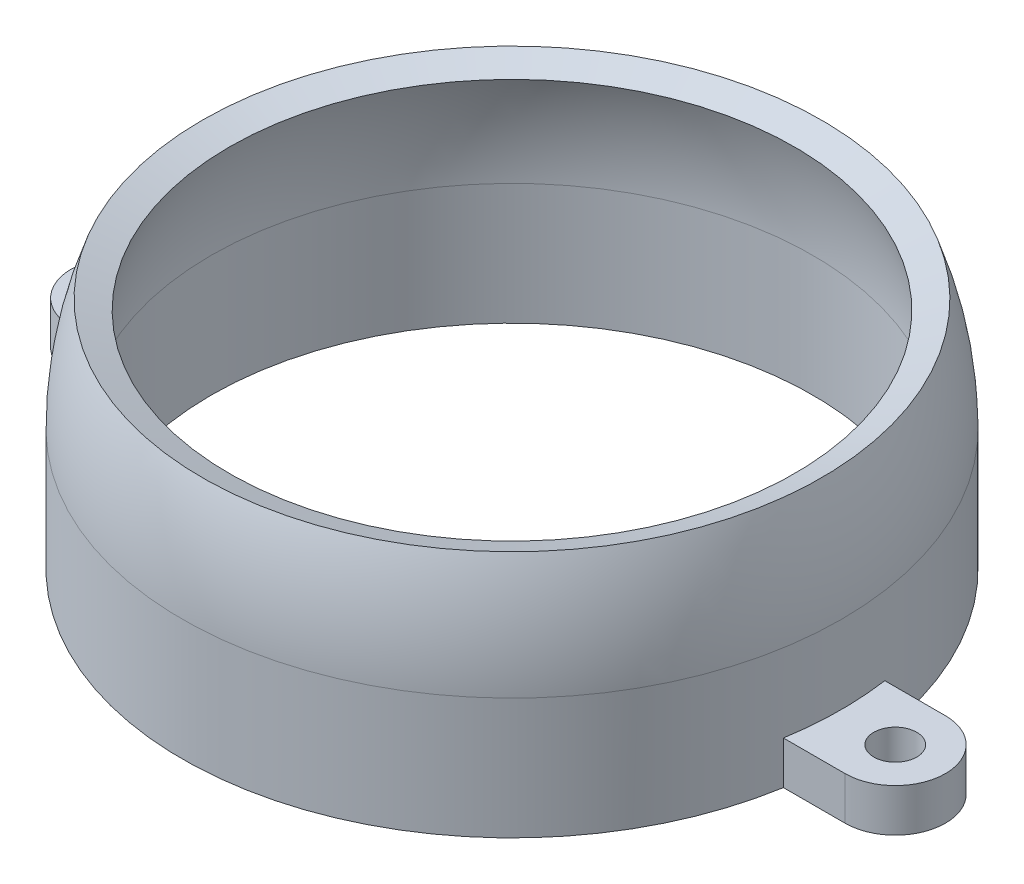
ISO-10303-21;
HEADER;
FILE_DESCRIPTION(('STEP AP214'),'2;1');
FILE_NAME('part.step','',(''),(''),'','','');
FILE_SCHEMA(('AUTOMOTIVE_DESIGN { 1 0 10303 214 1 1 1 1 }'));
ENDSEC;
DATA;
#1=APPLICATION_CONTEXT('core data for automotive mechanical design processes');
#2=APPLICATION_PROTOCOL_DEFINITION('international standard','automotive_design',2000,#1);
#3=PRODUCT_CONTEXT('',#1,'mechanical');
#4=PRODUCT('Part','Part','',(#3));
#5=PRODUCT_RELATED_PRODUCT_CATEGORY('part','',(#4));
#6=PRODUCT_DEFINITION_FORMATION('','',#4);
#7=PRODUCT_DEFINITION_CONTEXT('part definition',#1,'design');
#8=PRODUCT_DEFINITION('design','',#6,#7);
#9=PRODUCT_DEFINITION_SHAPE('','',#8);
#10=(LENGTH_UNIT() NAMED_UNIT(*) SI_UNIT(.MILLI.,.METRE.));
#11=(NAMED_UNIT(*) PLANE_ANGLE_UNIT() SI_UNIT($,.RADIAN.));
#12=(NAMED_UNIT(*) SI_UNIT($,.STERADIAN.) SOLID_ANGLE_UNIT());
#13=UNCERTAINTY_MEASURE_WITH_UNIT(LENGTH_MEASURE(1.E-05),#10,'distance_accuracy_value','');
#14=(GEOMETRIC_REPRESENTATION_CONTEXT(3) GLOBAL_UNCERTAINTY_ASSIGNED_CONTEXT((#13)) GLOBAL_UNIT_ASSIGNED_CONTEXT((#10,
#11,#12)) REPRESENTATION_CONTEXT('',''));
#15=CARTESIAN_POINT('',(0.,0.,0.));
#16=DIRECTION('',(0.,0.,1.));
#17=DIRECTION('',(1.,0.,0.));
#18=AXIS2_PLACEMENT_3D('',#15,#16,#17);
#19=CARTESIAN_POINT('',(0.,17.,0.));
#20=DIRECTION('',(0.,-1.,0.));
#21=DIRECTION('',(1.,0.,0.));
#22=AXIS2_PLACEMENT_3D('',#19,#20,#21);
#23=PLANE('',#22);
#24=CARTESIAN_POINT('',(-27.,17.,0.250000000000004));
#25=DIRECTION('',(0.,-1.,0.));
#26=DIRECTION('',(1.,0.,0.));
#27=AXIS2_PLACEMENT_3D('',#24,#25,#26);
#28=CIRCLE('',#27,1.5);
#29=CARTESIAN_POINT('',(-25.5,17.,0.250000000000004));
#30=VERTEX_POINT('',#29);
#31=EDGE_CURVE('E177',#30,#30,#28,.F.);
#32=ORIENTED_EDGE('',*,*,#31,.T.);
#33=EDGE_LOOP('',(#32));
#34=FACE_BOUND('',#33,.T.);
#35=DIRECTION('',(-1.,0.,0.));
#36=VECTOR('',#35,1.);
#37=CARTESIAN_POINT('',(-27.,17.,-3.25));
#38=LINE('',#37,#36);
#39=CARTESIAN_POINT('',(-22.7692226481274,17.,-3.24999999999999));
#40=VERTEX_POINT('',#39);
#41=CARTESIAN_POINT('',(-27.,17.,-3.25));
#42=VERTEX_POINT('',#41);
#43=EDGE_CURVE('E117',#40,#42,#38,.T.);
#44=ORIENTED_EDGE('',*,*,#43,.F.);
#45=CARTESIAN_POINT('',(0.,17.,0.));
#46=DIRECTION('',(0.,-1.,0.));
#47=DIRECTION('',(1.,0.,0.));
#48=AXIS2_PLACEMENT_3D('',#45,#46,#47);
#49=CIRCLE('',#48,23.);
#50=CARTESIAN_POINT('',(22.7692226481274,17.,-3.25));
#51=VERTEX_POINT('',#50);
#52=EDGE_CURVE('E175',#40,#51,#49,.T.);
#53=ORIENTED_EDGE('',*,*,#52,.T.);
#54=DIRECTION('',(-1.,0.,0.));
#55=VECTOR('',#54,1.);
#56=CARTESIAN_POINT('',(27.,17.,-3.25));
#57=LINE('',#56,#55);
#58=CARTESIAN_POINT('',(27.,17.,-3.25));
#59=VERTEX_POINT('',#58);
#60=EDGE_CURVE('E168',#59,#51,#57,.T.);
#61=ORIENTED_EDGE('',*,*,#60,.F.);
#62=CARTESIAN_POINT('',(27.,17.,0.250000000000004));
#63=DIRECTION('',(0.,-1.,0.));
#64=DIRECTION('',(1.,0.,0.));
#65=AXIS2_PLACEMENT_3D('',#62,#63,#64);
#66=CIRCLE('',#65,3.5);
#67=CARTESIAN_POINT('',(27.,17.,3.75));
#68=VERTEX_POINT('',#67);
#69=EDGE_CURVE('E170',#68,#59,#66,.F.);
#70=ORIENTED_EDGE('',*,*,#69,.F.);
#71=DIRECTION('',(1.,0.,0.));
#72=VECTOR('',#71,1.);
#73=CARTESIAN_POINT('',(27.,17.,3.75));
#74=LINE('',#73,#72);
#75=CARTESIAN_POINT('',(22.6922343545099,17.,3.75));
#76=VERTEX_POINT('',#75);
#77=EDGE_CURVE('E165',#76,#68,#74,.T.);
#78=ORIENTED_EDGE('',*,*,#77,.F.);
#79=CARTESIAN_POINT('',(-22.6922343545099,17.,3.75));
#80=VERTEX_POINT('',#79);
#81=EDGE_CURVE('E112',#76,#80,#49,.T.);
#82=ORIENTED_EDGE('',*,*,#81,.T.);
#83=DIRECTION('',(1.,0.,0.));
#84=VECTOR('',#83,1.);
#85=CARTESIAN_POINT('',(-27.,17.,3.75));
#86=LINE('',#85,#84);
#87=CARTESIAN_POINT('',(-27.,17.,3.75));
#88=VERTEX_POINT('',#87);
#89=EDGE_CURVE('E106',#88,#80,#86,.T.);
#90=ORIENTED_EDGE('',*,*,#89,.F.);
#91=CARTESIAN_POINT('',(-27.,17.,0.250000000000004));
#92=DIRECTION('',(0.,-1.,0.));
#93=DIRECTION('',(1.,0.,0.));
#94=AXIS2_PLACEMENT_3D('',#91,#92,#93);
#95=CIRCLE('',#94,3.5);
#96=EDGE_CURVE('E109',#42,#88,#95,.F.);
#97=ORIENTED_EDGE('',*,*,#96,.F.);
#98=EDGE_LOOP('',(#44,#53,#61,#70,#78,#82,#90,#97));
#99=FACE_BOUND('',#98,.T.);
#100=CARTESIAN_POINT('',(27.,17.,0.250000000000004));
#101=DIRECTION('',(0.,-1.,0.));
#102=DIRECTION('',(1.,0.,0.));
#103=AXIS2_PLACEMENT_3D('',#100,#101,#102);
#104=CIRCLE('',#103,1.5);
#105=CARTESIAN_POINT('',(28.5,17.,0.250000000000004));
#106=VERTEX_POINT('',#105);
#107=EDGE_CURVE('E139',#106,#106,#104,.F.);
#108=ORIENTED_EDGE('',*,*,#107,.T.);
#109=EDGE_LOOP('',(#108));
#110=FACE_BOUND('',#109,.T.);
#111=CARTESIAN_POINT('',(0.,17.,0.));
#112=DIRECTION('',(0.,-1.,0.));
#113=DIRECTION('',(1.,0.,0.));
#114=AXIS2_PLACEMENT_3D('',#111,#112,#113);
#115=CIRCLE('',#114,21.);
#116=CARTESIAN_POINT('',(21.,17.,0.));
#117=VERTEX_POINT('',#116);
#118=EDGE_CURVE('E125',#117,#117,#115,.T.);
#119=ORIENTED_EDGE('',*,*,#118,.F.);
#120=EDGE_LOOP('',(#119));
#121=FACE_BOUND('',#120,.T.);
#122=ADVANCED_FACE('F37',(#34,#99,#110,#121),#23,.T.);
#123=CARTESIAN_POINT('',(0.,25.4499443206436,0.));
#124=DIRECTION('',(0.,1.,0.));
#125=DIRECTION('',(-1.,0.,0.));
#126=AXIS2_PLACEMENT_3D('',#123,#124,#125);
#127=CYLINDRICAL_SURFACE('',#126,23.);
#128=CARTESIAN_POINT('',(0.,25.4499443206436,0.));
#129=DIRECTION('',(0.,1.,0.));
#130=DIRECTION('',(-1.,0.,0.));
#131=AXIS2_PLACEMENT_3D('',#128,#129,#130);
#132=CIRCLE('',#131,23.);
#133=CARTESIAN_POINT('',(-23.,25.4499443206436,0.));
#134=VERTEX_POINT('',#133);
#135=EDGE_CURVE('E167',#134,#134,#132,.T.);
#136=ORIENTED_EDGE('',*,*,#135,.F.);
#137=EDGE_LOOP('',(#136));
#138=FACE_BOUND('',#137,.T.);
#139=ORIENTED_EDGE('',*,*,#81,.F.);
#140=DIRECTION('',(0.,-1.,0.));
#141=VECTOR('',#140,1.);
#142=CARTESIAN_POINT('',(22.6922343545099,20.,3.75));
#143=LINE('',#142,#141);
#144=CARTESIAN_POINT('',(22.6922343545099,20.,3.75));
#145=VERTEX_POINT('',#144);
#146=EDGE_CURVE('E149',#145,#76,#143,.T.);
#147=ORIENTED_EDGE('',*,*,#146,.F.);
#148=CARTESIAN_POINT('',(0.,20.,0.));
#149=DIRECTION('',(0.,1.,0.));
#150=DIRECTION('',(0.,0.,-1.));
#151=AXIS2_PLACEMENT_3D('',#148,#149,#150);
#152=CIRCLE('',#151,23.);
#153=CARTESIAN_POINT('',(22.7692226481274,20.,-3.25));
#154=VERTEX_POINT('',#153);
#155=EDGE_CURVE('E153',#145,#154,#152,.T.);
#156=ORIENTED_EDGE('',*,*,#155,.T.);
#157=DIRECTION('',(0.,-1.,0.));
#158=VECTOR('',#157,1.);
#159=CARTESIAN_POINT('',(22.7692226481274,20.,-3.25));
#160=LINE('',#159,#158);
#161=EDGE_CURVE('E146',#154,#51,#160,.T.);
#162=ORIENTED_EDGE('',*,*,#161,.T.);
#163=ORIENTED_EDGE('',*,*,#52,.F.);
#164=DIRECTION('',(0.,-1.,0.));
#165=VECTOR('',#164,1.);
#166=CARTESIAN_POINT('',(-22.7692226481274,20.,-3.24999999999999));
#167=LINE('',#166,#165);
#168=CARTESIAN_POINT('',(-22.7692226481274,20.,-3.24999999999999));
#169=VERTEX_POINT('',#168);
#170=EDGE_CURVE('E133',#169,#40,#167,.T.);
#171=ORIENTED_EDGE('',*,*,#170,.F.);
#172=CARTESIAN_POINT('',(0.,20.,0.));
#173=DIRECTION('',(0.,1.,0.));
#174=DIRECTION('',(0.,0.,1.));
#175=AXIS2_PLACEMENT_3D('',#172,#173,#174);
#176=CIRCLE('',#175,23.);
#177=CARTESIAN_POINT('',(-22.6922343545099,20.,3.75));
#178=VERTEX_POINT('',#177);
#179=EDGE_CURVE('E240',#169,#178,#176,.T.);
#180=ORIENTED_EDGE('',*,*,#179,.T.);
#181=DIRECTION('',(0.,-1.,0.));
#182=VECTOR('',#181,1.);
#183=CARTESIAN_POINT('',(-22.6922343545099,20.,3.75));
#184=LINE('',#183,#182);
#185=EDGE_CURVE('E130',#178,#80,#184,.T.);
#186=ORIENTED_EDGE('',*,*,#185,.T.);
#187=EDGE_LOOP('',(#139,#147,#156,#162,#163,#171,#180,#186));
#188=FACE_BOUND('',#187,.T.);
#189=ADVANCED_FACE('F202',(#138,#188),#127,.T.);
#190=CARTESIAN_POINT('',(0.,25.4499443206436,0.));
#191=DIRECTION('',(0.,1.,0.));
#192=DIRECTION('',(-1.,0.,0.));
#193=AXIS2_PLACEMENT_3D('',#190,#191,#192);
#194=CYLINDRICAL_SURFACE('',#193,21.);
#195=CARTESIAN_POINT('',(0.,25.4499443206436,0.));
#196=DIRECTION('',(0.,1.,0.));
#197=DIRECTION('',(-1.,0.,0.));
#198=AXIS2_PLACEMENT_3D('',#195,#196,#197);
#199=CIRCLE('',#198,21.);
#200=CARTESIAN_POINT('',(-21.,25.4499443206436,0.));
#201=VERTEX_POINT('',#200);
#202=EDGE_CURVE('E247',#201,#201,#199,.T.);
#203=ORIENTED_EDGE('',*,*,#202,.T.);
#204=EDGE_LOOP('',(#203));
#205=FACE_BOUND('',#204,.T.);
#206=ORIENTED_EDGE('',*,*,#118,.T.);
#207=EDGE_LOOP('',(#206));
#208=FACE_BOUND('',#207,.T.);
#209=ADVANCED_FACE('F204',(#205,#208),#194,.F.);
#210=CARTESIAN_POINT('',(-27.,20.,0.250000000000004));
#211=DIRECTION('',(0.,-1.,0.));
#212=DIRECTION('',(0.,0.,-1.));
#213=AXIS2_PLACEMENT_3D('',#210,#211,#212);
#214=CYLINDRICAL_SURFACE('',#213,3.5);
#215=DIRECTION('',(0.,-1.,0.));
#216=VECTOR('',#215,1.);
#217=CARTESIAN_POINT('',(-27.,20.,-3.25));
#218=LINE('',#217,#216);
#219=CARTESIAN_POINT('',(-27.,20.,-3.25));
#220=VERTEX_POINT('',#219);
#221=EDGE_CURVE('E124',#220,#42,#218,.T.);
#222=ORIENTED_EDGE('',*,*,#221,.T.);
#223=ORIENTED_EDGE('',*,*,#96,.T.);
#224=DIRECTION('',(0.,-1.,0.));
#225=VECTOR('',#224,1.);
#226=CARTESIAN_POINT('',(-27.,20.,3.75));
#227=LINE('',#226,#225);
#228=CARTESIAN_POINT('',(-27.,20.,3.75));
#229=VERTEX_POINT('',#228);
#230=EDGE_CURVE('E122',#229,#88,#227,.T.);
#231=ORIENTED_EDGE('',*,*,#230,.F.);
#232=CARTESIAN_POINT('',(-27.,20.,0.250000000000004));
#233=DIRECTION('',(0.,-1.,0.));
#234=DIRECTION('',(0.,0.,-1.));
#235=AXIS2_PLACEMENT_3D('',#232,#233,#234);
#236=CIRCLE('',#235,3.5);
#237=EDGE_CURVE('E237',#229,#220,#236,.T.);
#238=ORIENTED_EDGE('',*,*,#237,.T.);
#239=EDGE_LOOP('',(#222,#223,#231,#238));
#240=FACE_BOUND('',#239,.T.);
#241=ADVANCED_FACE('F120',(#240),#214,.T.);
#242=CARTESIAN_POINT('',(-27.,20.,3.75));
#243=DIRECTION('',(0.,0.,1.));
#244=DIRECTION('',(1.,0.,0.));
#245=AXIS2_PLACEMENT_3D('',#242,#243,#244);
#246=PLANE('',#245);
#247=ORIENTED_EDGE('',*,*,#230,.T.);
#248=ORIENTED_EDGE('',*,*,#89,.T.);
#249=ORIENTED_EDGE('',*,*,#185,.F.);
#250=DIRECTION('',(-1.,0.,0.));
#251=VECTOR('',#250,1.);
#252=CARTESIAN_POINT('',(-27.,20.,3.75));
#253=LINE('',#252,#251);
#254=EDGE_CURVE('E129',#178,#229,#253,.T.);
#255=ORIENTED_EDGE('',*,*,#254,.T.);
#256=EDGE_LOOP('',(#247,#248,#249,#255));
#257=FACE_BOUND('',#256,.T.);
#258=ADVANCED_FACE('F39',(#257),#246,.T.);
#259=CARTESIAN_POINT('',(-27.,20.,-3.25));
#260=DIRECTION('',(0.,0.,-1.));
#261=DIRECTION('',(-1.,0.,0.));
#262=AXIS2_PLACEMENT_3D('',#259,#260,#261);
#263=PLANE('',#262);
#264=ORIENTED_EDGE('',*,*,#170,.T.);
#265=ORIENTED_EDGE('',*,*,#43,.T.);
#266=ORIENTED_EDGE('',*,*,#221,.F.);
#267=DIRECTION('',(1.,0.,0.));
#268=VECTOR('',#267,1.);
#269=CARTESIAN_POINT('',(-27.,20.,-3.25));
#270=LINE('',#269,#268);
#271=EDGE_CURVE('E238',#220,#169,#270,.T.);
#272=ORIENTED_EDGE('',*,*,#271,.T.);
#273=EDGE_LOOP('',(#264,#265,#266,#272));
#274=FACE_BOUND('',#273,.T.);
#275=ADVANCED_FACE('F226',(#274),#263,.T.);
#276=CARTESIAN_POINT('',(-27.,20.,0.250000000000004));
#277=DIRECTION('',(0.,-1.,0.));
#278=DIRECTION('',(0.,0.,-1.));
#279=AXIS2_PLACEMENT_3D('',#276,#277,#278);
#280=CYLINDRICAL_SURFACE('',#279,1.5);
#281=CARTESIAN_POINT('',(-27.,20.,0.250000000000004));
#282=DIRECTION('',(0.,-1.,0.));
#283=DIRECTION('',(0.,0.,-1.));
#284=AXIS2_PLACEMENT_3D('',#281,#282,#283);
#285=CIRCLE('',#284,1.5);
#286=CARTESIAN_POINT('',(-27.,20.,-1.25));
#287=VERTEX_POINT('',#286);
#288=EDGE_CURVE('E147',#287,#287,#285,.T.);
#289=ORIENTED_EDGE('',*,*,#288,.F.);
#290=EDGE_LOOP('',(#289));
#291=FACE_BOUND('',#290,.T.);
#292=ORIENTED_EDGE('',*,*,#31,.F.);
#293=EDGE_LOOP('',(#292));
#294=FACE_BOUND('',#293,.T.);
#295=ADVANCED_FACE('F220',(#291,#294),#280,.F.);
#296=CARTESIAN_POINT('',(27.,20.,0.250000000000004));
#297=DIRECTION('',(0.,-1.,0.));
#298=DIRECTION('',(0.,0.,-1.));
#299=AXIS2_PLACEMENT_3D('',#296,#297,#298);
#300=CYLINDRICAL_SURFACE('',#299,3.5);
#301=DIRECTION('',(0.,-1.,0.));
#302=VECTOR('',#301,1.);
#303=CARTESIAN_POINT('',(27.,20.,3.75));
#304=LINE('',#303,#302);
#305=CARTESIAN_POINT('',(27.,20.,3.75));
#306=VERTEX_POINT('',#305);
#307=EDGE_CURVE('E41',#306,#68,#304,.T.);
#308=ORIENTED_EDGE('',*,*,#307,.T.);
#309=ORIENTED_EDGE('',*,*,#69,.T.);
#310=DIRECTION('',(0.,-1.,0.));
#311=VECTOR('',#310,1.);
#312=CARTESIAN_POINT('',(27.,20.,-3.25));
#313=LINE('',#312,#311);
#314=CARTESIAN_POINT('',(27.,20.,-3.25));
#315=VERTEX_POINT('',#314);
#316=EDGE_CURVE('E61',#315,#59,#313,.T.);
#317=ORIENTED_EDGE('',*,*,#316,.F.);
#318=CARTESIAN_POINT('',(27.,20.,0.250000000000004));
#319=DIRECTION('',(0.,-1.,0.));
#320=DIRECTION('',(0.,0.,1.));
#321=AXIS2_PLACEMENT_3D('',#318,#319,#320);
#322=CIRCLE('',#321,3.5);
#323=EDGE_CURVE('E46',#315,#306,#322,.T.);
#324=ORIENTED_EDGE('',*,*,#323,.T.);
#325=EDGE_LOOP('',(#308,#309,#317,#324));
#326=FACE_BOUND('',#325,.T.);
#327=ADVANCED_FACE('F218',(#326),#300,.T.);
#328=CARTESIAN_POINT('',(27.,20.,-3.25));
#329=DIRECTION('',(0.,0.,-1.));
#330=DIRECTION('',(-1.,0.,0.));
#331=AXIS2_PLACEMENT_3D('',#328,#329,#330);
#332=PLANE('',#331);
#333=ORIENTED_EDGE('',*,*,#316,.T.);
#334=ORIENTED_EDGE('',*,*,#60,.T.);
#335=ORIENTED_EDGE('',*,*,#161,.F.);
#336=DIRECTION('',(1.,0.,0.));
#337=VECTOR('',#336,1.);
#338=CARTESIAN_POINT('',(27.,20.,-3.25));
#339=LINE('',#338,#337);
#340=EDGE_CURVE('E151',#154,#315,#339,.T.);
#341=ORIENTED_EDGE('',*,*,#340,.T.);
#342=EDGE_LOOP('',(#333,#334,#335,#341));
#343=FACE_BOUND('',#342,.T.);
#344=ADVANCED_FACE('F198',(#343),#332,.T.);
#345=CARTESIAN_POINT('',(27.,20.,3.75));
#346=DIRECTION('',(0.,0.,1.));
#347=DIRECTION('',(1.,0.,0.));
#348=AXIS2_PLACEMENT_3D('',#345,#346,#347);
#349=PLANE('',#348);
#350=ORIENTED_EDGE('',*,*,#146,.T.);
#351=ORIENTED_EDGE('',*,*,#77,.T.);
#352=ORIENTED_EDGE('',*,*,#307,.F.);
#353=DIRECTION('',(-1.,0.,0.));
#354=VECTOR('',#353,1.);
#355=CARTESIAN_POINT('',(27.,20.,3.75));
#356=LINE('',#355,#354);
#357=EDGE_CURVE('E158',#306,#145,#356,.T.);
#358=ORIENTED_EDGE('',*,*,#357,.T.);
#359=EDGE_LOOP('',(#350,#351,#352,#358));
#360=FACE_BOUND('',#359,.T.);
#361=ADVANCED_FACE('F188',(#360),#349,.T.);
#362=CARTESIAN_POINT('',(27.,20.,0.250000000000004));
#363=DIRECTION('',(0.,-1.,0.));
#364=DIRECTION('',(0.,0.,-1.));
#365=AXIS2_PLACEMENT_3D('',#362,#363,#364);
#366=CYLINDRICAL_SURFACE('',#365,1.5);
#367=CARTESIAN_POINT('',(27.,20.,0.250000000000004));
#368=DIRECTION('',(0.,-1.,0.));
#369=DIRECTION('',(0.,0.,1.));
#370=AXIS2_PLACEMENT_3D('',#367,#368,#369);
#371=CIRCLE('',#370,1.5);
#372=CARTESIAN_POINT('',(27.,20.,1.75));
#373=VERTEX_POINT('',#372);
#374=EDGE_CURVE('E11',#373,#373,#371,.T.);
#375=ORIENTED_EDGE('',*,*,#374,.F.);
#376=EDGE_LOOP('',(#375));
#377=FACE_BOUND('',#376,.T.);
#378=ORIENTED_EDGE('',*,*,#107,.F.);
#379=EDGE_LOOP('',(#378));
#380=FACE_BOUND('',#379,.T.);
#381=ADVANCED_FACE('F185',(#377,#380),#366,.F.);
#382=CARTESIAN_POINT('',(0.,25.4499443206436,0.));
#383=DIRECTION('',(0.,1.,0.));
#384=DIRECTION('',(-1.,0.,0.));
#385=AXIS2_PLACEMENT_3D('',#382,#383,#384);
#386=SPHERICAL_SURFACE('',#385,23.);
#387=CARTESIAN_POINT('',(0.,33.316407617134,0.));
#388=DIRECTION('',(0.,1.,0.));
#389=DIRECTION('',(-1.,0.,0.));
#390=AXIS2_PLACEMENT_3D('',#387,#388,#389);
#391=CIRCLE('',#390,21.6129302780759);
#392=CARTESIAN_POINT('',(-21.6129302780759,33.316407617134,0.));
#393=VERTEX_POINT('',#392);
#394=EDGE_CURVE('E131',#393,#393,#391,.T.);
#395=ORIENTED_EDGE('',*,*,#394,.F.);
#396=EDGE_LOOP('',(#395));
#397=FACE_BOUND('',#396,.T.);
#398=ORIENTED_EDGE('',*,*,#135,.T.);
#399=EDGE_LOOP('',(#398));
#400=FACE_BOUND('',#399,.T.);
#401=ADVANCED_FACE('F187',(#397,#400),#386,.T.);
#402=CARTESIAN_POINT('',(0.,25.4499443206436,0.));
#403=DIRECTION('',(0.,1.,0.));
#404=DIRECTION('',(-1.,0.,0.));
#405=AXIS2_PLACEMENT_3D('',#402,#403,#404);
#406=SPHERICAL_SURFACE('',#405,21.);
#407=CARTESIAN_POINT('',(0.,32.6323673304827,0.));
#408=DIRECTION('',(0.,1.,0.));
#409=DIRECTION('',(-1.,0.,0.));
#410=AXIS2_PLACEMENT_3D('',#407,#408,#409);
#411=CIRCLE('',#410,19.7335450365041);
#412=CARTESIAN_POINT('',(-19.7335450365041,32.6323673304827,0.));
#413=VERTEX_POINT('',#412);
#414=EDGE_CURVE('E136',#413,#413,#411,.T.);
#415=ORIENTED_EDGE('',*,*,#414,.T.);
#416=EDGE_LOOP('',(#415));
#417=FACE_BOUND('',#416,.T.);
#418=ORIENTED_EDGE('',*,*,#202,.F.);
#419=EDGE_LOOP('',(#418));
#420=FACE_BOUND('',#419,.T.);
#421=ADVANCED_FACE('F195',(#417,#420),#406,.F.);
#422=CARTESIAN_POINT('',(0.,32.6323673304827,0.));
#423=DIRECTION('',(0.,1.,0.));
#424=DIRECTION('',(-1.,0.,0.));
#425=AXIS2_PLACEMENT_3D('',#422,#423,#424);
#426=CONICAL_SURFACE('',#425,19.7335450365041,1.22173047639603);
#427=ORIENTED_EDGE('',*,*,#394,.T.);
#428=EDGE_LOOP('',(#427));
#429=FACE_BOUND('',#428,.T.);
#430=ORIENTED_EDGE('',*,*,#414,.F.);
#431=EDGE_LOOP('',(#430));
#432=FACE_BOUND('',#431,.T.);
#433=ADVANCED_FACE('F256',(#429,#432),#426,.F.);
#434=CARTESIAN_POINT('',(-27.,20.,0.250000000000004));
#435=DIRECTION('',(0.,-1.,0.));
#436=DIRECTION('',(0.,0.,-1.));
#437=AXIS2_PLACEMENT_3D('',#434,#435,#436);
#438=PLANE('',#437);
#439=ORIENTED_EDGE('',*,*,#288,.T.);
#440=EDGE_LOOP('',(#439));
#441=FACE_BOUND('',#440,.T.);
#442=ORIENTED_EDGE('',*,*,#237,.F.);
#443=ORIENTED_EDGE('',*,*,#254,.F.);
#444=ORIENTED_EDGE('',*,*,#179,.F.);
#445=ORIENTED_EDGE('',*,*,#271,.F.);
#446=EDGE_LOOP('',(#442,#443,#444,#445));
#447=FACE_BOUND('',#446,.T.);
#448=ADVANCED_FACE('F262',(#441,#447),#438,.F.);
#449=CARTESIAN_POINT('',(27.,20.,0.250000000000004));
#450=DIRECTION('',(0.,1.,0.));
#451=DIRECTION('',(0.,0.,1.));
#452=AXIS2_PLACEMENT_3D('',#449,#450,#451);
#453=PLANE('',#452);
#454=ORIENTED_EDGE('',*,*,#374,.T.);
#455=EDGE_LOOP('',(#454));
#456=FACE_BOUND('',#455,.T.);
#457=ORIENTED_EDGE('',*,*,#323,.F.);
#458=ORIENTED_EDGE('',*,*,#340,.F.);
#459=ORIENTED_EDGE('',*,*,#155,.F.);
#460=ORIENTED_EDGE('',*,*,#357,.F.);
#461=EDGE_LOOP('',(#457,#458,#459,#460));
#462=FACE_BOUND('',#461,.T.);
#463=ADVANCED_FACE('F214',(#456,#462),#453,.T.);
#464=CLOSED_SHELL('',(#122,#189,#209,#241,#258,#275,#295,#327,#344,#361,#381,#401,#421,#433,
#448,#463));
#465=MANIFOLD_SOLID_BREP('B2',#464);
#466=ADVANCED_BREP_SHAPE_REPRESENTATION('',(#18,#465),#14);
#467=SHAPE_DEFINITION_REPRESENTATION(#9,#466);
ENDSEC;
END-ISO-10303-21;
